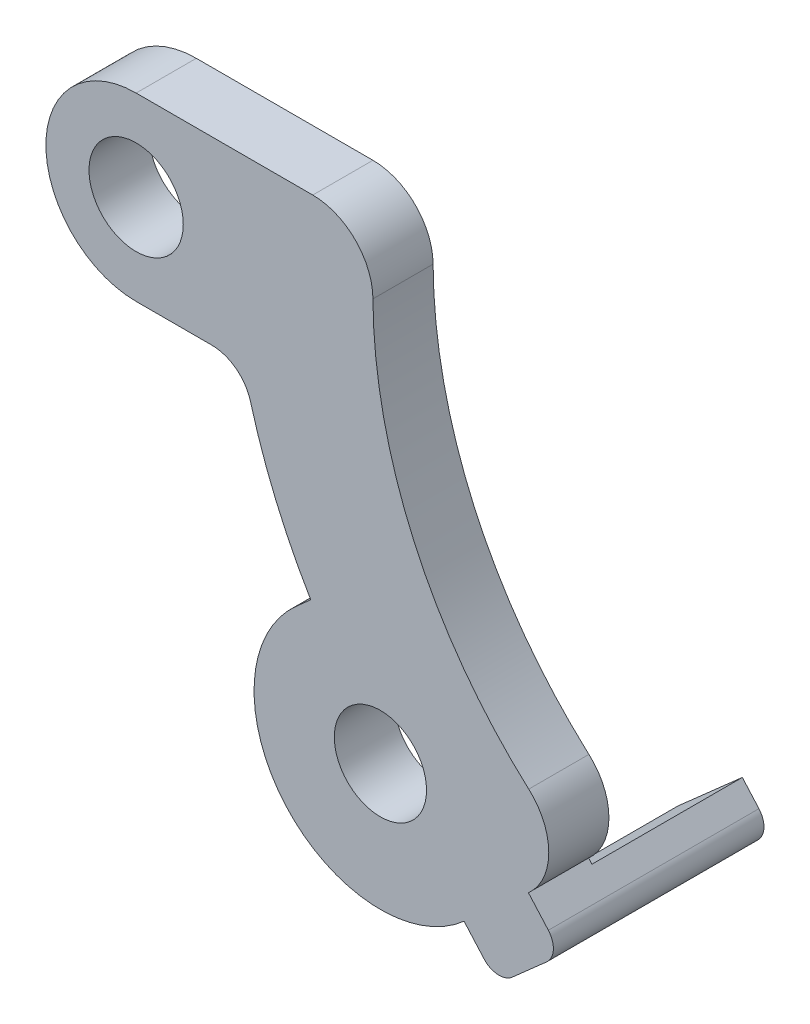
ISO-10303-21;
HEADER;
FILE_DESCRIPTION(('STEP AP214'),'2;1');
FILE_NAME('part.step','',(''),(''),'','','');
FILE_SCHEMA(('AUTOMOTIVE_DESIGN { 1 0 10303 214 1 1 1 1 }'));
ENDSEC;
DATA;
#1=APPLICATION_CONTEXT('core data for automotive mechanical design processes');
#2=APPLICATION_PROTOCOL_DEFINITION('international standard','automotive_design',2000,#1);
#3=PRODUCT_CONTEXT('',#1,'mechanical');
#4=PRODUCT('Part','Part','',(#3));
#5=PRODUCT_RELATED_PRODUCT_CATEGORY('part','',(#4));
#6=PRODUCT_DEFINITION_FORMATION('','',#4);
#7=PRODUCT_DEFINITION_CONTEXT('part definition',#1,'design');
#8=PRODUCT_DEFINITION('design','',#6,#7);
#9=PRODUCT_DEFINITION_SHAPE('','',#8);
#10=(LENGTH_UNIT() NAMED_UNIT(*) SI_UNIT(.MILLI.,.METRE.));
#11=(NAMED_UNIT(*) PLANE_ANGLE_UNIT() SI_UNIT($,.RADIAN.));
#12=(NAMED_UNIT(*) SI_UNIT($,.STERADIAN.) SOLID_ANGLE_UNIT());
#13=UNCERTAINTY_MEASURE_WITH_UNIT(LENGTH_MEASURE(1.E-05),#10,'distance_accuracy_value','');
#14=(GEOMETRIC_REPRESENTATION_CONTEXT(3) GLOBAL_UNCERTAINTY_ASSIGNED_CONTEXT((#13)) GLOBAL_UNIT_ASSIGNED_CONTEXT((#10,
#11,#12)) REPRESENTATION_CONTEXT('',''));
#15=CARTESIAN_POINT('',(0.,0.,0.));
#16=DIRECTION('',(0.,0.,1.));
#17=DIRECTION('',(1.,0.,0.));
#18=AXIS2_PLACEMENT_3D('',#15,#16,#17);
#19=CARTESIAN_POINT('',(0.,0.,-137.743878979662));
#20=DIRECTION('',(0.,0.,-1.));
#21=DIRECTION('',(-1.,0.,0.));
#22=AXIS2_PLACEMENT_3D('',#19,#20,#21);
#23=PLANE('',#22);
#24=DIRECTION('',(0.662197796471717,-0.749329085481141,0.));
#25=VECTOR('',#24,1.);
#26=CARTESIAN_POINT('',(-5.70893089002412,26.2575941253346,-137.743878979662));
#27=LINE('',#26,#25);
#28=CARTESIAN_POINT('',(-7.19887593208549,27.9435845676672,-137.743878979662));
#29=VERTEX_POINT('',#28);
#30=CARTESIAN_POINT('',(-6.37112868649584,27.0069232108158,-137.743878979662));
#31=VERTEX_POINT('',#30);
#32=EDGE_CURVE('E170',#29,#31,#27,.T.);
#33=ORIENTED_EDGE('',*,*,#32,.F.);
#34=DIRECTION('',(-0.749329085481141,-0.662197796471717,0.));
#35=VECTOR('',#34,1.);
#36=CARTESIAN_POINT('',(-3.98934773701553,30.7799118098221,-137.743878979662));
#37=LINE('',#36,#35);
#38=CARTESIAN_POINT('',(-3.98934773701552,30.7799118098221,-137.743878979662));
#39=VERTEX_POINT('',#38);
#40=EDGE_CURVE('E157',#39,#29,#37,.T.);
#41=ORIENTED_EDGE('',*,*,#40,.F.);
#42=DIRECTION('',(-0.662197796471717,0.749329085481141,0.));
#43=VECTOR('',#42,1.);
#44=CARTESIAN_POINT('',(-4.15489718613345,30.9672440811924,-137.743878979662));
#45=LINE('',#44,#43);
#46=CARTESIAN_POINT('',(-3.16160049142587,29.8432504529707,-137.743878979662));
#47=VERTEX_POINT('',#46);
#48=EDGE_CURVE('E182',#47,#39,#45,.T.);
#49=ORIENTED_EDGE('',*,*,#48,.F.);
#50=CARTESIAN_POINT('',(-3.91092957690702,29.181052656499,-137.743878979662));
#51=DIRECTION('',(0.,0.,-1.));
#52=DIRECTION('',(-1.,0.,0.));
#53=AXIS2_PLACEMENT_3D('',#50,#51,#52);
#54=CIRCLE('',#53,1.);
#55=CARTESIAN_POINT('',(-3.2487317804353,28.4317235710178,-137.743878979662));
#56=VERTEX_POINT('',#55);
#57=EDGE_CURVE('E292',#47,#56,#54,.T.);
#58=ORIENTED_EDGE('',*,*,#57,.T.);
#59=DIRECTION('',(0.749329085481141,0.662197796471717,0.));
#60=VECTOR('',#59,1.);
#61=CARTESIAN_POINT('',(-2.49940269495416,29.0939213674895,-137.743878979662));
#62=LINE('',#61,#60);
#63=CARTESIAN_POINT('',(-4.95960180454298,26.9197919218064,-137.743878979662));
#64=VERTEX_POINT('',#63);
#65=EDGE_CURVE('E178',#64,#56,#62,.T.);
#66=ORIENTED_EDGE('',*,*,#65,.F.);
#67=CARTESIAN_POINT('',(-5.6217996010147,27.6691210072875,-137.743878979662));
#68=DIRECTION('',(0.,0.,-1.));
#69=DIRECTION('',(-1.,0.,0.));
#70=AXIS2_PLACEMENT_3D('',#67,#68,#69);
#71=CIRCLE('',#70,1.);
#72=EDGE_CURVE('E176',#64,#31,#71,.T.);
#73=ORIENTED_EDGE('',*,*,#72,.T.);
#74=EDGE_LOOP('',(#33,#41,#49,#58,#66,#73));
#75=FACE_BOUND('',#74,.T.);
#76=ADVANCED_FACE('F40',(#75),#23,.T.);
#77=CARTESIAN_POINT('',(-19.9422261752407,44.7189600164803,-127.243878979662));
#78=DIRECTION('',(0.,0.,-1.));
#79=DIRECTION('',(-1.,0.,0.));
#80=AXIS2_PLACEMENT_3D('',#77,#78,#79);
#81=CYLINDRICAL_SURFACE('',#80,2.);
#82=CARTESIAN_POINT('',(-19.9422261752407,44.7189600164803,-130.243878979662));
#83=DIRECTION('',(0.,0.,1.));
#84=DIRECTION('',(1.,0.,0.));
#85=AXIS2_PLACEMENT_3D('',#82,#83,#84);
#86=CIRCLE('',#85,2.);
#87=CARTESIAN_POINT('',(-19.9422261752407,46.7189600164803,-130.243878979662));
#88=VERTEX_POINT('',#87);
#89=CARTESIAN_POINT('',(-18.0136160189661,45.2485477541048,-130.243878979662));
#90=VERTEX_POINT('',#89);
#91=EDGE_CURVE('E195',#88,#90,#86,.F.);
#92=ORIENTED_EDGE('',*,*,#91,.T.);
#93=DIRECTION('',(0.,0.,-1.));
#94=VECTOR('',#93,1.);
#95=CARTESIAN_POINT('',(-18.0136160189661,45.2485477541048,-127.243878979662));
#96=LINE('',#95,#94);
#97=CARTESIAN_POINT('',(-18.0136160189661,45.2485477541048,-127.243878979662));
#98=VERTEX_POINT('',#97);
#99=EDGE_CURVE('E283',#98,#90,#96,.T.);
#100=ORIENTED_EDGE('',*,*,#99,.F.);
#101=CARTESIAN_POINT('',(-19.9422261752407,44.7189600164803,-127.243878979662));
#102=DIRECTION('',(0.,0.,1.));
#103=DIRECTION('',(1.,0.,0.));
#104=AXIS2_PLACEMENT_3D('',#101,#102,#103);
#105=CIRCLE('',#104,2.);
#106=CARTESIAN_POINT('',(-19.9422261752407,46.7189600164803,-127.243878979662));
#107=VERTEX_POINT('',#106);
#108=EDGE_CURVE('E196',#107,#98,#105,.F.);
#109=ORIENTED_EDGE('',*,*,#108,.F.);
#110=DIRECTION('',(0.,0.,-1.));
#111=VECTOR('',#110,1.);
#112=CARTESIAN_POINT('',(-19.9422261752407,46.7189600164803,-127.243878979662));
#113=LINE('',#112,#111);
#114=EDGE_CURVE('E228',#107,#88,#113,.T.);
#115=ORIENTED_EDGE('',*,*,#114,.T.);
#116=EDGE_LOOP('',(#92,#100,#109,#115));
#117=FACE_BOUND('',#116,.T.);
#118=ADVANCED_FACE('F333',(#117),#81,.F.);
#119=CARTESIAN_POINT('',(9.61372850102481,52.8348932025687,-127.243878979662));
#120=DIRECTION('',(0.,0.,-1.));
#121=DIRECTION('',(-1.,0.,0.));
#122=AXIS2_PLACEMENT_3D('',#119,#120,#121);
#123=CYLINDRICAL_SURFACE('',#122,28.6500052117645);
#124=CARTESIAN_POINT('',(9.61372850102481,52.8348932025687,-130.243878979662));
#125=DIRECTION('',(0.,0.,1.));
#126=DIRECTION('',(1.,0.,0.));
#127=AXIS2_PLACEMENT_3D('',#124,#125,#126);
#128=CIRCLE('',#127,28.6500052117645);
#129=CARTESIAN_POINT('',(-15.0100594881716,38.189351894841,-130.243878979662));
#130=VERTEX_POINT('',#129);
#131=EDGE_CURVE('E231',#90,#130,#128,.T.);
#132=ORIENTED_EDGE('',*,*,#131,.T.);
#133=DIRECTION('',(0.,0.,-1.));
#134=VECTOR('',#133,1.);
#135=CARTESIAN_POINT('',(-15.0100594881716,38.189351894841,-127.243878979662));
#136=LINE('',#135,#134);
#137=CARTESIAN_POINT('',(-15.0100594881716,38.189351894841,-127.243878979662));
#138=VERTEX_POINT('',#137);
#139=EDGE_CURVE('E280',#138,#130,#136,.T.);
#140=ORIENTED_EDGE('',*,*,#139,.F.);
#141=CARTESIAN_POINT('',(9.61372850102481,52.8348932025687,-127.243878979662));
#142=DIRECTION('',(0.,0.,1.));
#143=DIRECTION('',(1.,0.,0.));
#144=AXIS2_PLACEMENT_3D('',#141,#142,#143);
#145=CIRCLE('',#144,28.6500052117645);
#146=EDGE_CURVE('E199',#98,#138,#145,.T.);
#147=ORIENTED_EDGE('',*,*,#146,.F.);
#148=ORIENTED_EDGE('',*,*,#99,.T.);
#149=EDGE_LOOP('',(#132,#140,#147,#148));
#150=FACE_BOUND('',#149,.T.);
#151=ADVANCED_FACE('F338',(#150),#123,.T.);
#152=CARTESIAN_POINT('',(-25.5317117816848,28.8911475424345,-127.243878979662));
#153=DIRECTION('',(0.662197796471688,-0.749329085481166,0.));
#154=DIRECTION('',(0.749329085481166,0.662197796471688,0.));
#155=AXIS2_PLACEMENT_3D('',#152,#153,#154);
#156=PLANE('',#155);
#157=DIRECTION('',(-0.749329085481166,-0.662197796471688,0.));
#158=VECTOR('',#157,1.);
#159=CARTESIAN_POINT('',(-25.5317117816848,28.8911475424345,-130.243878979662));
#160=LINE('',#159,#158);
#161=CARTESIAN_POINT('',(-15.7081176167469,37.5724633161,-130.243878979662));
#162=VERTEX_POINT('',#161);
#163=EDGE_CURVE('E233',#130,#162,#160,.T.);
#164=ORIENTED_EDGE('',*,*,#163,.T.);
#165=DIRECTION('',(0.,0.,-1.));
#166=VECTOR('',#165,1.);
#167=CARTESIAN_POINT('',(-15.7081176167469,37.5724633161,-127.243878979662));
#168=LINE('',#167,#166);
#169=CARTESIAN_POINT('',(-15.7081176167469,37.5724633161,-127.243878979662));
#170=VERTEX_POINT('',#169);
#171=EDGE_CURVE('E277',#170,#162,#168,.T.);
#172=ORIENTED_EDGE('',*,*,#171,.F.);
#173=DIRECTION('',(-0.749329085481166,-0.662197796471688,0.));
#174=VECTOR('',#173,1.);
#175=CARTESIAN_POINT('',(-25.5317117816848,28.8911475424345,-127.243878979662));
#176=LINE('',#175,#174);
#177=EDGE_CURVE('E202',#138,#170,#176,.T.);
#178=ORIENTED_EDGE('',*,*,#177,.F.);
#179=ORIENTED_EDGE('',*,*,#139,.T.);
#180=EDGE_LOOP('',(#164,#172,#178,#179));
#181=FACE_BOUND('',#180,.T.);
#182=ADVANCED_FACE('F386',(#181),#156,.F.);
#183=CARTESIAN_POINT('',(-11.5362714989752,32.8516900775687,-127.243878979662));
#184=DIRECTION('',(0.,0.,-1.));
#185=DIRECTION('',(-1.,0.,0.));
#186=AXIS2_PLACEMENT_3D('',#183,#184,#185);
#187=CYLINDRICAL_SURFACE('',#186,6.30000000000002);
#188=CARTESIAN_POINT('',(-11.5362714989752,32.8516900775687,-130.243878979662));
#189=DIRECTION('',(0.,0.,1.));
#190=DIRECTION('',(1.,0.,0.));
#191=AXIS2_PLACEMENT_3D('',#188,#189,#190);
#192=CIRCLE('',#191,6.30000000000002);
#193=CARTESIAN_POINT('',(-7.36442538120342,28.1309168390375,-130.243878979662));
#194=VERTEX_POINT('',#193);
#195=EDGE_CURVE('E235',#162,#194,#192,.T.);
#196=ORIENTED_EDGE('',*,*,#195,.T.);
#197=DIRECTION('',(0.,0.,-1.));
#198=VECTOR('',#197,1.);
#199=CARTESIAN_POINT('',(-7.36442538120341,28.1309168390375,-127.243878979662));
#200=LINE('',#199,#198);
#201=CARTESIAN_POINT('',(-7.36442538120341,28.1309168390375,-127.243878979662));
#202=VERTEX_POINT('',#201);
#203=EDGE_CURVE('E275',#202,#194,#200,.T.);
#204=ORIENTED_EDGE('',*,*,#203,.F.);
#205=CARTESIAN_POINT('',(-11.5362714989752,32.8516900775687,-127.243878979662));
#206=DIRECTION('',(0.,0.,1.));
#207=DIRECTION('',(1.,0.,0.));
#208=AXIS2_PLACEMENT_3D('',#205,#206,#207);
#209=CIRCLE('',#208,6.30000000000002);
#210=EDGE_CURVE('E204',#170,#202,#209,.T.);
#211=ORIENTED_EDGE('',*,*,#210,.F.);
#212=ORIENTED_EDGE('',*,*,#171,.T.);
#213=EDGE_LOOP('',(#196,#204,#211,#212));
#214=FACE_BOUND('',#213,.T.);
#215=ADVANCED_FACE('F312',(#214),#187,.T.);
#216=CARTESIAN_POINT('',(-6.14149057554769,33.2152313376348,-127.243878979662));
#217=DIRECTION('',(0.,0.,-1.));
#218=DIRECTION('',(-1.,0.,0.));
#219=AXIS2_PLACEMENT_3D('',#216,#217,#218);
#220=CYLINDRICAL_SURFACE('',#219,3.);
#221=CARTESIAN_POINT('',(-6.14149057554769,33.2152313376348,-130.243878979662));
#222=DIRECTION('',(0.,0.,1.));
#223=DIRECTION('',(1.,0.,0.));
#224=AXIS2_PLACEMENT_3D('',#221,#222,#223);
#225=CIRCLE('',#224,3.);
#226=CARTESIAN_POINT('',(-4.13884807824677,35.4489329802013,-130.243878979662));
#227=VERTEX_POINT('',#226);
#228=CARTESIAN_POINT('',(-4.15489718613346,30.9672440811924,-130.243878979662));
#229=VERTEX_POINT('',#228);
#230=EDGE_CURVE('E238',#227,#229,#225,.F.);
#231=ORIENTED_EDGE('',*,*,#230,.F.);
#232=DIRECTION('',(0.,0.,-1.));
#233=VECTOR('',#232,1.);
#234=CARTESIAN_POINT('',(-4.13884807824677,35.4489329802013,-127.243878979662));
#235=LINE('',#234,#233);
#236=CARTESIAN_POINT('',(-4.13884807824677,35.4489329802013,-127.243878979662));
#237=VERTEX_POINT('',#236);
#238=EDGE_CURVE('E270',#237,#227,#235,.T.);
#239=ORIENTED_EDGE('',*,*,#238,.F.);
#240=CARTESIAN_POINT('',(-6.14149057554769,33.2152313376348,-127.243878979662));
#241=DIRECTION('',(0.,0.,1.));
#242=DIRECTION('',(1.,0.,0.));
#243=AXIS2_PLACEMENT_3D('',#240,#241,#242);
#244=CIRCLE('',#243,3.);
#245=CARTESIAN_POINT('',(-4.15489718613345,30.9672440811924,-127.243878979662));
#246=VERTEX_POINT('',#245);
#247=EDGE_CURVE('E207',#237,#246,#244,.F.);
#248=ORIENTED_EDGE('',*,*,#247,.T.);
#249=DIRECTION('',(0.,0.,-1.));
#250=VECTOR('',#249,1.);
#251=CARTESIAN_POINT('',(-4.15489718613345,30.9672440811924,-127.243878979662));
#252=LINE('',#251,#250);
#253=EDGE_CURVE('E272',#246,#229,#252,.T.);
#254=ORIENTED_EDGE('',*,*,#253,.T.);
#255=EDGE_LOOP('',(#231,#239,#248,#254));
#256=FACE_BOUND('',#255,.T.);
#257=ADVANCED_FACE('F379',(#256),#220,.T.);
#258=CARTESIAN_POINT('',(11.4637285010269,52.8516900775688,-127.243878979662));
#259=DIRECTION('',(0.,0.,-1.));
#260=DIRECTION('',(-1.,0.,0.));
#261=AXIS2_PLACEMENT_3D('',#258,#259,#260);
#262=CYLINDRICAL_SURFACE('',#261,23.3729833462071);
#263=CARTESIAN_POINT('',(11.4637285010269,52.8516900775688,-130.243878979662));
#264=DIRECTION('',(0.,0.,1.));
#265=DIRECTION('',(1.,0.,0.));
#266=AXIS2_PLACEMENT_3D('',#263,#264,#265);
#267=CIRCLE('',#266,23.3729833462071);
#268=CARTESIAN_POINT('',(-11.908958834779,52.7340584290504,-130.243878979662));
#269=VERTEX_POINT('',#268);
#270=EDGE_CURVE('E241',#269,#227,#267,.T.);
#271=ORIENTED_EDGE('',*,*,#270,.F.);
#272=DIRECTION('',(0.,0.,-1.));
#273=VECTOR('',#272,1.);
#274=CARTESIAN_POINT('',(-11.908958834779,52.7340584290504,-127.243878979662));
#275=LINE('',#274,#273);
#276=CARTESIAN_POINT('',(-11.908958834779,52.7340584290504,-127.243878979662));
#277=VERTEX_POINT('',#276);
#278=EDGE_CURVE('E268',#277,#269,#275,.T.);
#279=ORIENTED_EDGE('',*,*,#278,.F.);
#280=CARTESIAN_POINT('',(11.4637285010269,52.8516900775688,-127.243878979662));
#281=DIRECTION('',(0.,0.,1.));
#282=DIRECTION('',(1.,0.,0.));
#283=AXIS2_PLACEMENT_3D('',#280,#281,#282);
#284=CIRCLE('',#283,23.3729833462071);
#285=EDGE_CURVE('E210',#277,#237,#284,.T.);
#286=ORIENTED_EDGE('',*,*,#285,.T.);
#287=ORIENTED_EDGE('',*,*,#238,.T.);
#288=EDGE_LOOP('',(#271,#279,#286,#287));
#289=FACE_BOUND('',#288,.T.);
#290=ADVANCED_FACE('F375',(#289),#262,.F.);
#291=CARTESIAN_POINT('',(-14.9089208408614,52.7189600164802,-127.243878979662));
#292=DIRECTION('',(0.,0.,-1.));
#293=DIRECTION('',(-1.,0.,0.));
#294=AXIS2_PLACEMENT_3D('',#291,#292,#293);
#295=CYLINDRICAL_SURFACE('',#294,3.);
#296=CARTESIAN_POINT('',(-14.9089208408614,52.7189600164802,-130.243878979662));
#297=DIRECTION('',(0.,0.,1.));
#298=DIRECTION('',(1.,0.,0.));
#299=AXIS2_PLACEMENT_3D('',#296,#297,#298);
#300=CIRCLE('',#299,3.);
#301=CARTESIAN_POINT('',(-14.9089208408614,55.7189600164802,-130.243878979662));
#302=VERTEX_POINT('',#301);
#303=EDGE_CURVE('E244',#269,#302,#300,.T.);
#304=ORIENTED_EDGE('',*,*,#303,.T.);
#305=DIRECTION('',(0.,0.,-1.));
#306=VECTOR('',#305,1.);
#307=CARTESIAN_POINT('',(-14.9089208408614,55.7189600164802,-127.243878979662));
#308=LINE('',#307,#306);
#309=CARTESIAN_POINT('',(-14.9089208408614,55.7189600164802,-127.243878979662));
#310=VERTEX_POINT('',#309);
#311=EDGE_CURVE('E266',#310,#302,#308,.T.);
#312=ORIENTED_EDGE('',*,*,#311,.F.);
#313=CARTESIAN_POINT('',(-14.9089208408614,52.7189600164802,-127.243878979662));
#314=DIRECTION('',(0.,0.,1.));
#315=DIRECTION('',(1.,0.,0.));
#316=AXIS2_PLACEMENT_3D('',#313,#314,#315);
#317=CIRCLE('',#316,3.);
#318=EDGE_CURVE('E213',#277,#310,#317,.T.);
#319=ORIENTED_EDGE('',*,*,#318,.F.);
#320=ORIENTED_EDGE('',*,*,#278,.T.);
#321=EDGE_LOOP('',(#304,#312,#319,#320));
#322=FACE_BOUND('',#321,.T.);
#323=ADVANCED_FACE('F371',(#322),#295,.T.);
#324=CARTESIAN_POINT('',(0.,55.7189600164802,-127.243878979662));
#325=DIRECTION('',(0.,1.,0.));
#326=DIRECTION('',(0.,0.,1.));
#327=AXIS2_PLACEMENT_3D('',#324,#325,#326);
#328=PLANE('',#327);
#329=DIRECTION('',(1.,0.,0.));
#330=VECTOR('',#329,1.);
#331=CARTESIAN_POINT('',(0.,55.7189600164802,-130.243878979662));
#332=LINE('',#331,#330);
#333=CARTESIAN_POINT('',(-23.7160538447542,55.7189600164802,-130.243878979662));
#334=VERTEX_POINT('',#333);
#335=EDGE_CURVE('E247',#334,#302,#332,.T.);
#336=ORIENTED_EDGE('',*,*,#335,.F.);
#337=DIRECTION('',(0.,0.,-1.));
#338=VECTOR('',#337,1.);
#339=CARTESIAN_POINT('',(-23.7160538447542,55.7189600164802,-127.243878979662));
#340=LINE('',#339,#338);
#341=CARTESIAN_POINT('',(-23.7160538447542,55.7189600164802,-127.243878979662));
#342=VERTEX_POINT('',#341);
#343=EDGE_CURVE('E264',#342,#334,#340,.T.);
#344=ORIENTED_EDGE('',*,*,#343,.F.);
#345=DIRECTION('',(1.,0.,0.));
#346=VECTOR('',#345,1.);
#347=CARTESIAN_POINT('',(0.,55.7189600164802,-127.243878979662));
#348=LINE('',#347,#346);
#349=EDGE_CURVE('E215',#342,#310,#348,.T.);
#350=ORIENTED_EDGE('',*,*,#349,.T.);
#351=ORIENTED_EDGE('',*,*,#311,.T.);
#352=EDGE_LOOP('',(#336,#344,#350,#351));
#353=FACE_BOUND('',#352,.T.);
#354=ADVANCED_FACE('F367',(#353),#328,.T.);
#355=CARTESIAN_POINT('',(-23.7160538447542,51.2189600164802,-127.243878979662));
#356=DIRECTION('',(0.,0.,-1.));
#357=DIRECTION('',(-1.,0.,0.));
#358=AXIS2_PLACEMENT_3D('',#355,#356,#357);
#359=CYLINDRICAL_SURFACE('',#358,4.5);
#360=CARTESIAN_POINT('',(-23.7160538447542,51.2189600164802,-130.243878979662));
#361=DIRECTION('',(0.,0.,1.));
#362=DIRECTION('',(1.,0.,0.));
#363=AXIS2_PLACEMENT_3D('',#360,#361,#362);
#364=CIRCLE('',#363,4.5);
#365=CARTESIAN_POINT('',(-23.7160538447542,46.7189600164802,-130.243878979662));
#366=VERTEX_POINT('',#365);
#367=EDGE_CURVE('E250',#334,#366,#364,.T.);
#368=ORIENTED_EDGE('',*,*,#367,.T.);
#369=DIRECTION('',(0.,0.,-1.));
#370=VECTOR('',#369,1.);
#371=CARTESIAN_POINT('',(-23.7160538447542,46.7189600164802,-127.243878979662));
#372=LINE('',#371,#370);
#373=CARTESIAN_POINT('',(-23.7160538447542,46.7189600164802,-127.243878979662));
#374=VERTEX_POINT('',#373);
#375=EDGE_CURVE('E261',#374,#366,#372,.T.);
#376=ORIENTED_EDGE('',*,*,#375,.F.);
#377=CARTESIAN_POINT('',(-23.7160538447542,51.2189600164802,-127.243878979662));
#378=DIRECTION('',(0.,0.,1.));
#379=DIRECTION('',(1.,0.,0.));
#380=AXIS2_PLACEMENT_3D('',#377,#378,#379);
#381=CIRCLE('',#380,4.5);
#382=EDGE_CURVE('E218',#342,#374,#381,.T.);
#383=ORIENTED_EDGE('',*,*,#382,.F.);
#384=ORIENTED_EDGE('',*,*,#343,.T.);
#385=EDGE_LOOP('',(#368,#376,#383,#384));
#386=FACE_BOUND('',#385,.T.);
#387=ADVANCED_FACE('F360',(#386),#359,.T.);
#388=CARTESIAN_POINT('',(-23.7160538447542,51.2189600164802,-127.243878979662));
#389=DIRECTION('',(0.,0.,-1.));
#390=DIRECTION('',(-1.,0.,0.));
#391=AXIS2_PLACEMENT_3D('',#388,#389,#390);
#392=CYLINDRICAL_SURFACE('',#391,2.35);
#393=CARTESIAN_POINT('',(-23.7160538447542,51.2189600164802,-127.243878979662));
#394=DIRECTION('',(0.,0.,1.));
#395=DIRECTION('',(1.,0.,0.));
#396=AXIS2_PLACEMENT_3D('',#393,#394,#395);
#397=CIRCLE('',#396,2.35);
#398=CARTESIAN_POINT('',(-21.3660538447542,51.2189600164802,-127.243878979662));
#399=VERTEX_POINT('',#398);
#400=EDGE_CURVE('E222',#399,#399,#397,.T.);
#401=ORIENTED_EDGE('',*,*,#400,.T.);
#402=EDGE_LOOP('',(#401));
#403=FACE_BOUND('',#402,.T.);
#404=CARTESIAN_POINT('',(-23.7160538447542,51.2189600164802,-130.243878979662));
#405=DIRECTION('',(0.,0.,1.));
#406=DIRECTION('',(1.,0.,0.));
#407=AXIS2_PLACEMENT_3D('',#404,#405,#406);
#408=CIRCLE('',#407,2.35);
#409=CARTESIAN_POINT('',(-21.3660538447542,51.2189600164802,-130.243878979662));
#410=VERTEX_POINT('',#409);
#411=EDGE_CURVE('E254',#410,#410,#408,.T.);
#412=ORIENTED_EDGE('',*,*,#411,.F.);
#413=EDGE_LOOP('',(#412));
#414=FACE_BOUND('',#413,.T.);
#415=ADVANCED_FACE('F357',(#403,#414),#392,.F.);
#416=CARTESIAN_POINT('',(0.,46.7189600164803,-127.243878979662));
#417=DIRECTION('',(0.,1.,0.));
#418=DIRECTION('',(-1.,0.,0.));
#419=AXIS2_PLACEMENT_3D('',#416,#417,#418);
#420=PLANE('',#419);
#421=DIRECTION('',(1.,0.,0.));
#422=VECTOR('',#421,1.);
#423=CARTESIAN_POINT('',(0.,46.7189600164803,-130.243878979662));
#424=LINE('',#423,#422);
#425=EDGE_CURVE('E252',#366,#88,#424,.T.);
#426=ORIENTED_EDGE('',*,*,#425,.T.);
#427=ORIENTED_EDGE('',*,*,#114,.F.);
#428=DIRECTION('',(1.,0.,0.));
#429=VECTOR('',#428,1.);
#430=CARTESIAN_POINT('',(0.,46.7189600164803,-127.243878979662));
#431=LINE('',#430,#429);
#432=EDGE_CURVE('E220',#374,#107,#431,.T.);
#433=ORIENTED_EDGE('',*,*,#432,.F.);
#434=ORIENTED_EDGE('',*,*,#375,.T.);
#435=EDGE_LOOP('',(#426,#427,#433,#434));
#436=FACE_BOUND('',#435,.T.);
#437=ADVANCED_FACE('F355',(#436),#420,.F.);
#438=CARTESIAN_POINT('',(-11.5362714989739,32.8516900775688,-127.243878979662));
#439=DIRECTION('',(0.,0.,-1.));
#440=DIRECTION('',(-1.,0.,0.));
#441=AXIS2_PLACEMENT_3D('',#438,#439,#440);
#442=CYLINDRICAL_SURFACE('',#441,2.3);
#443=CARTESIAN_POINT('',(-11.5362714989739,32.8516900775688,-127.243878979662));
#444=DIRECTION('',(0.,0.,1.));
#445=DIRECTION('',(1.,0.,0.));
#446=AXIS2_PLACEMENT_3D('',#443,#444,#445);
#447=CIRCLE('',#446,2.3);
#448=CARTESIAN_POINT('',(-9.23627149897394,32.8516900775688,-127.243878979662));
#449=VERTEX_POINT('',#448);
#450=EDGE_CURVE('E225',#449,#449,#447,.T.);
#451=ORIENTED_EDGE('',*,*,#450,.T.);
#452=EDGE_LOOP('',(#451));
#453=FACE_BOUND('',#452,.T.);
#454=CARTESIAN_POINT('',(-11.5362714989739,32.8516900775688,-130.243878979662));
#455=DIRECTION('',(0.,0.,1.));
#456=DIRECTION('',(1.,0.,0.));
#457=AXIS2_PLACEMENT_3D('',#454,#455,#456);
#458=CIRCLE('',#457,2.3);
#459=CARTESIAN_POINT('',(-9.23627149897394,32.8516900775688,-130.243878979662));
#460=VERTEX_POINT('',#459);
#461=EDGE_CURVE('E200',#460,#460,#458,.T.);
#462=ORIENTED_EDGE('',*,*,#461,.F.);
#463=EDGE_LOOP('',(#462));
#464=FACE_BOUND('',#463,.T.);
#465=ADVANCED_FACE('F350',(#453,#464),#442,.F.);
#466=CARTESIAN_POINT('',(0.,0.,-127.243878979662));
#467=DIRECTION('',(0.,0.,1.));
#468=DIRECTION('',(1.,0.,0.));
#469=AXIS2_PLACEMENT_3D('',#466,#467,#468);
#470=PLANE('',#469);
#471=DIRECTION('',(-0.662197796471717,0.749329085481141,0.));
#472=VECTOR('',#471,1.);
#473=CARTESIAN_POINT('',(-5.70893089002412,26.2575941253346,-127.243878979662));
#474=LINE('',#473,#472);
#475=CARTESIAN_POINT('',(-6.37112868649584,27.0069232108158,-127.243878979662));
#476=VERTEX_POINT('',#475);
#477=EDGE_CURVE('E191',#476,#202,#474,.T.);
#478=ORIENTED_EDGE('',*,*,#477,.F.);
#479=CARTESIAN_POINT('',(-5.6217996010147,27.6691210072875,-127.243878979662));
#480=DIRECTION('',(0.,0.,1.));
#481=DIRECTION('',(1.,0.,0.));
#482=AXIS2_PLACEMENT_3D('',#479,#480,#481);
#483=CIRCLE('',#482,1.);
#484=CARTESIAN_POINT('',(-4.95960180454298,26.9197919218064,-127.243878979662));
#485=VERTEX_POINT('',#484);
#486=EDGE_CURVE('E48',#476,#485,#483,.T.);
#487=ORIENTED_EDGE('',*,*,#486,.T.);
#488=DIRECTION('',(-0.749329085481141,-0.662197796471717,0.));
#489=VECTOR('',#488,1.);
#490=CARTESIAN_POINT('',(-2.49940269495416,29.0939213674895,-127.243878979662));
#491=LINE('',#490,#489);
#492=CARTESIAN_POINT('',(-3.2487317804353,28.4317235710178,-127.243878979662));
#493=VERTEX_POINT('',#492);
#494=EDGE_CURVE('E188',#493,#485,#491,.T.);
#495=ORIENTED_EDGE('',*,*,#494,.F.);
#496=CARTESIAN_POINT('',(-3.91092957690702,29.181052656499,-127.243878979662));
#497=DIRECTION('',(0.,0.,1.));
#498=DIRECTION('',(1.,0.,0.));
#499=AXIS2_PLACEMENT_3D('',#496,#497,#498);
#500=CIRCLE('',#499,1.);
#501=CARTESIAN_POINT('',(-3.16160049142588,29.8432504529707,-127.243878979662));
#502=VERTEX_POINT('',#501);
#503=EDGE_CURVE('E63',#493,#502,#500,.T.);
#504=ORIENTED_EDGE('',*,*,#503,.T.);
#505=DIRECTION('',(-0.662197796471717,0.749329085481141,0.));
#506=VECTOR('',#505,1.);
#507=CARTESIAN_POINT('',(-2.49940269495416,29.0939213674895,-127.243878979662));
#508=LINE('',#507,#506);
#509=EDGE_CURVE('E193',#502,#246,#508,.T.);
#510=ORIENTED_EDGE('',*,*,#509,.T.);
#511=ORIENTED_EDGE('',*,*,#247,.F.);
#512=ORIENTED_EDGE('',*,*,#285,.F.);
#513=ORIENTED_EDGE('',*,*,#318,.T.);
#514=ORIENTED_EDGE('',*,*,#349,.F.);
#515=ORIENTED_EDGE('',*,*,#382,.T.);
#516=ORIENTED_EDGE('',*,*,#432,.T.);
#517=ORIENTED_EDGE('',*,*,#108,.T.);
#518=ORIENTED_EDGE('',*,*,#146,.T.);
#519=ORIENTED_EDGE('',*,*,#177,.T.);
#520=ORIENTED_EDGE('',*,*,#210,.T.);
#521=EDGE_LOOP('',(#478,#487,#495,#504,#510,#511,#512,#513,#514,#515,#516,#517,#518,#519,#520));
#522=FACE_BOUND('',#521,.T.);
#523=ORIENTED_EDGE('',*,*,#400,.F.);
#524=EDGE_LOOP('',(#523));
#525=FACE_BOUND('',#524,.T.);
#526=ORIENTED_EDGE('',*,*,#450,.F.);
#527=EDGE_LOOP('',(#526));
#528=FACE_BOUND('',#527,.T.);
#529=ADVANCED_FACE('F299',(#522,#525,#528),#470,.T.);
#530=CARTESIAN_POINT('',(0.,0.,-130.243878979662));
#531=DIRECTION('',(0.,0.,1.));
#532=DIRECTION('',(1.,0.,0.));
#533=AXIS2_PLACEMENT_3D('',#530,#531,#532);
#534=PLANE('',#533);
#535=ORIENTED_EDGE('',*,*,#230,.T.);
#536=DIRECTION('',(-0.662197796471717,0.749329085481141,0.));
#537=VECTOR('',#536,1.);
#538=CARTESIAN_POINT('',(-3.98934773701553,30.7799118098221,-130.243878979662));
#539=LINE('',#538,#537);
#540=CARTESIAN_POINT('',(-3.98934773701553,30.7799118098221,-130.243878979662));
#541=VERTEX_POINT('',#540);
#542=EDGE_CURVE('E179',#541,#229,#539,.T.);
#543=ORIENTED_EDGE('',*,*,#542,.F.);
#544=DIRECTION('',(0.749329085481141,0.662197796471717,0.));
#545=VECTOR('',#544,1.);
#546=CARTESIAN_POINT('',(-7.19887593208549,27.9435845676672,-130.243878979662));
#547=LINE('',#546,#545);
#548=CARTESIAN_POINT('',(-7.19887593208549,27.9435845676672,-130.243878979662));
#549=VERTEX_POINT('',#548);
#550=EDGE_CURVE('E173',#549,#541,#547,.T.);
#551=ORIENTED_EDGE('',*,*,#550,.F.);
#552=DIRECTION('',(-0.662197796471717,0.749329085481141,0.));
#553=VECTOR('',#552,1.);
#554=CARTESIAN_POINT('',(-7.19887593208549,27.9435845676672,-130.243878979662));
#555=LINE('',#554,#553);
#556=EDGE_CURVE('E172',#549,#194,#555,.T.);
#557=ORIENTED_EDGE('',*,*,#556,.T.);
#558=ORIENTED_EDGE('',*,*,#195,.F.);
#559=ORIENTED_EDGE('',*,*,#163,.F.);
#560=ORIENTED_EDGE('',*,*,#131,.F.);
#561=ORIENTED_EDGE('',*,*,#91,.F.);
#562=ORIENTED_EDGE('',*,*,#425,.F.);
#563=ORIENTED_EDGE('',*,*,#367,.F.);
#564=ORIENTED_EDGE('',*,*,#335,.T.);
#565=ORIENTED_EDGE('',*,*,#303,.F.);
#566=ORIENTED_EDGE('',*,*,#270,.T.);
#567=EDGE_LOOP('',(#535,#543,#551,#557,#558,#559,#560,#561,#562,#563,#564,#565,#566));
#568=FACE_BOUND('',#567,.T.);
#569=ORIENTED_EDGE('',*,*,#411,.T.);
#570=EDGE_LOOP('',(#569));
#571=FACE_BOUND('',#570,.T.);
#572=ORIENTED_EDGE('',*,*,#461,.T.);
#573=EDGE_LOOP('',(#572));
#574=FACE_BOUND('',#573,.T.);
#575=ADVANCED_FACE('F316',(#568,#571,#574),#534,.F.);
#576=CARTESIAN_POINT('',(-5.70893089002412,26.2575941253346,-127.243878979662));
#577=DIRECTION('',(0.749329085481141,0.662197796471717,0.));
#578=DIRECTION('',(-0.662197796471717,0.749329085481141,0.));
#579=AXIS2_PLACEMENT_3D('',#576,#577,#578);
#580=PLANE('',#579);
#581=ORIENTED_EDGE('',*,*,#203,.T.);
#582=ORIENTED_EDGE('',*,*,#556,.F.);
#583=DIRECTION('',(0.,0.,1.));
#584=VECTOR('',#583,1.);
#585=CARTESIAN_POINT('',(-7.19887593208549,27.9435845676672,-137.743878979662));
#586=LINE('',#585,#584);
#587=EDGE_CURVE('E160',#29,#549,#586,.T.);
#588=ORIENTED_EDGE('',*,*,#587,.F.);
#589=ORIENTED_EDGE('',*,*,#32,.T.);
#590=DIRECTION('',(0.,0.,-1.));
#591=VECTOR('',#590,1.);
#592=CARTESIAN_POINT('',(-6.37112868649584,27.0069232108158,-127.243878979662));
#593=LINE('',#592,#591);
#594=EDGE_CURVE('E295',#31,#476,#593,.F.);
#595=ORIENTED_EDGE('',*,*,#594,.T.);
#596=ORIENTED_EDGE('',*,*,#477,.T.);
#597=EDGE_LOOP('',(#581,#582,#588,#589,#595,#596));
#598=FACE_BOUND('',#597,.T.);
#599=ADVANCED_FACE('F169',(#598),#580,.F.);
#600=CARTESIAN_POINT('',(-2.49940269495416,29.0939213674895,-130.243878979662));
#601=DIRECTION('',(-0.749329085481141,-0.662197796471717,0.));
#602=DIRECTION('',(0.662197796471717,-0.749329085481141,0.));
#603=AXIS2_PLACEMENT_3D('',#600,#601,#602);
#604=PLANE('',#603);
#605=DIRECTION('',(0.,0.,-1.));
#606=VECTOR('',#605,1.);
#607=CARTESIAN_POINT('',(-3.98934773701553,30.7799118098221,-130.243878979662));
#608=LINE('',#607,#606);
#609=EDGE_CURVE('E55',#541,#39,#608,.T.);
#610=ORIENTED_EDGE('',*,*,#609,.F.);
#611=ORIENTED_EDGE('',*,*,#542,.T.);
#612=ORIENTED_EDGE('',*,*,#253,.F.);
#613=ORIENTED_EDGE('',*,*,#509,.F.);
#614=DIRECTION('',(0.,0.,1.));
#615=VECTOR('',#614,1.);
#616=CARTESIAN_POINT('',(-3.16160049142588,29.8432504529707,-137.743878979662));
#617=LINE('',#616,#615);
#618=EDGE_CURVE('E12',#502,#47,#617,.F.);
#619=ORIENTED_EDGE('',*,*,#618,.T.);
#620=ORIENTED_EDGE('',*,*,#48,.T.);
#621=EDGE_LOOP('',(#610,#611,#612,#613,#619,#620));
#622=FACE_BOUND('',#621,.T.);
#623=ADVANCED_FACE('F321',(#622),#604,.F.);
#624=CARTESIAN_POINT('',(-15.5325250549626,17.5762783516679,0.));
#625=DIRECTION('',(0.662197796471717,-0.749329085481141,0.));
#626=DIRECTION('',(0.749329085481141,0.662197796471717,0.));
#627=AXIS2_PLACEMENT_3D('',#624,#625,#626);
#628=PLANE('',#627);
#629=ORIENTED_EDGE('',*,*,#494,.T.);
#630=DIRECTION('',(0.,0.,-1.));
#631=VECTOR('',#630,1.);
#632=CARTESIAN_POINT('',(-4.95960180454298,26.9197919218064,-137.743878979662));
#633=LINE('',#632,#631);
#634=EDGE_CURVE('E289',#485,#64,#633,.T.);
#635=ORIENTED_EDGE('',*,*,#634,.T.);
#636=ORIENTED_EDGE('',*,*,#65,.T.);
#637=DIRECTION('',(0.,0.,1.));
#638=VECTOR('',#637,1.);
#639=CARTESIAN_POINT('',(-3.2487317804353,28.4317235710178,-127.243878979662));
#640=LINE('',#639,#638);
#641=EDGE_CURVE('E286',#56,#493,#640,.T.);
#642=ORIENTED_EDGE('',*,*,#641,.T.);
#643=EDGE_LOOP('',(#629,#635,#636,#642));
#644=FACE_BOUND('',#643,.T.);
#645=ADVANCED_FACE('F304',(#644),#628,.T.);
#646=CARTESIAN_POINT('',(-5.6217996010147,27.6691210072875,0.));
#647=DIRECTION('',(0.,0.,1.));
#648=DIRECTION('',(1.,0.,0.));
#649=AXIS2_PLACEMENT_3D('',#646,#647,#648);
#650=CYLINDRICAL_SURFACE('',#649,1.);
#651=ORIENTED_EDGE('',*,*,#486,.F.);
#652=ORIENTED_EDGE('',*,*,#594,.F.);
#653=ORIENTED_EDGE('',*,*,#72,.F.);
#654=ORIENTED_EDGE('',*,*,#634,.F.);
#655=EDGE_LOOP('',(#651,#652,#653,#654));
#656=FACE_BOUND('',#655,.T.);
#657=ADVANCED_FACE('F306',(#656),#650,.T.);
#658=CARTESIAN_POINT('',(-3.91092957690702,29.181052656499,0.));
#659=DIRECTION('',(0.,0.,-1.));
#660=DIRECTION('',(-1.,0.,0.));
#661=AXIS2_PLACEMENT_3D('',#658,#659,#660);
#662=CYLINDRICAL_SURFACE('',#661,1.);
#663=ORIENTED_EDGE('',*,*,#57,.F.);
#664=ORIENTED_EDGE('',*,*,#618,.F.);
#665=ORIENTED_EDGE('',*,*,#503,.F.);
#666=ORIENTED_EDGE('',*,*,#641,.F.);
#667=EDGE_LOOP('',(#663,#664,#665,#666));
#668=FACE_BOUND('',#667,.T.);
#669=ADVANCED_FACE('F42',(#668),#662,.T.);
#670=CARTESIAN_POINT('',(-17.022470097024,19.2622687940005,0.));
#671=DIRECTION('',(-0.662197796471717,0.749329085481141,0.));
#672=DIRECTION('',(-0.749329085481141,-0.662197796471717,0.));
#673=AXIS2_PLACEMENT_3D('',#670,#671,#672);
#674=PLANE('',#673);
#675=ORIENTED_EDGE('',*,*,#40,.T.);
#676=ORIENTED_EDGE('',*,*,#587,.T.);
#677=ORIENTED_EDGE('',*,*,#550,.T.);
#678=ORIENTED_EDGE('',*,*,#609,.T.);
#679=EDGE_LOOP('',(#675,#676,#677,#678));
#680=FACE_BOUND('',#679,.T.);
#681=ADVANCED_FACE('F159',(#680),#674,.T.);
#682=CLOSED_SHELL('',(#76,#118,#151,#182,#215,#257,#290,#323,#354,#387,#415,#437,#465,#529,#575,
#599,#623,#645,#657,#669,#681));
#683=MANIFOLD_SOLID_BREP('B2',#682);
#684=ADVANCED_BREP_SHAPE_REPRESENTATION('',(#18,#683),#14);
#685=SHAPE_DEFINITION_REPRESENTATION(#9,#684);
ENDSEC;
END-ISO-10303-21;
